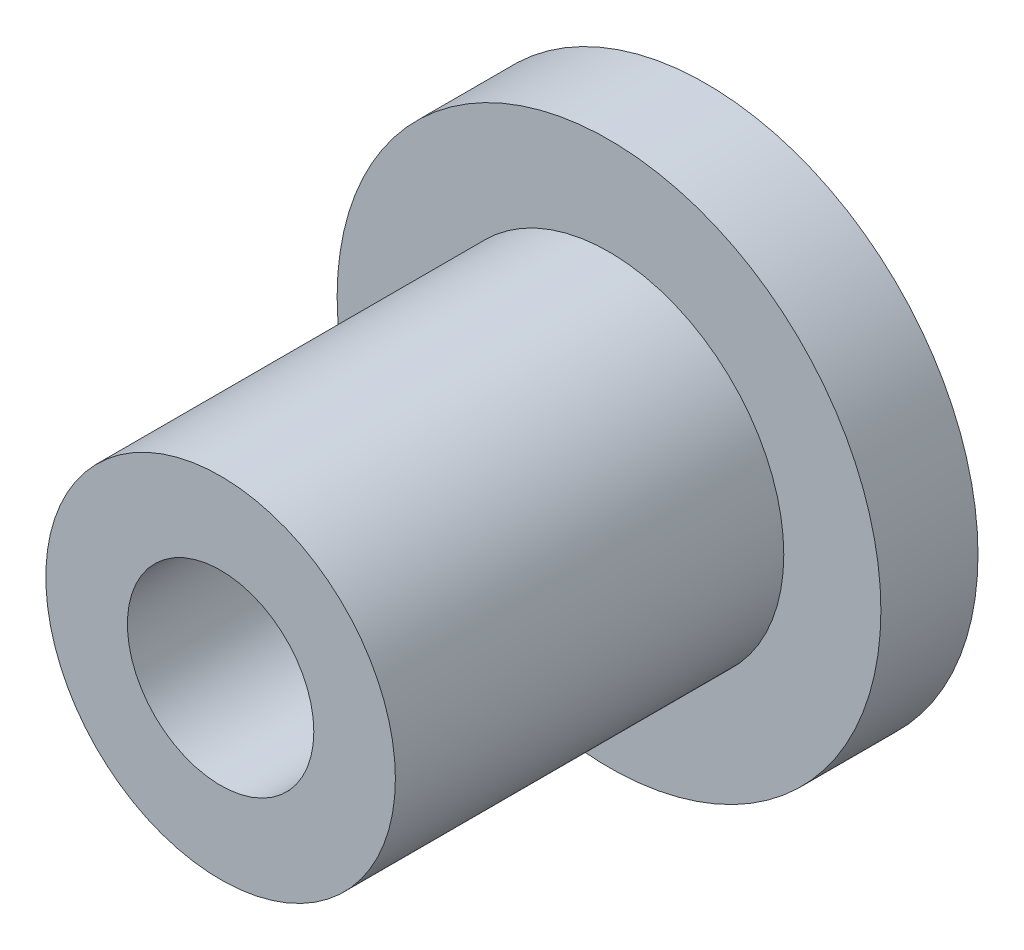
ISO-10303-21;
HEADER;
FILE_DESCRIPTION(('STEP AP214'),'2;1');
FILE_NAME('part.step','',(''),(''),'','','');
FILE_SCHEMA(('AUTOMOTIVE_DESIGN { 1 0 10303 214 1 1 1 1 }'));
ENDSEC;
DATA;
#1=APPLICATION_CONTEXT('core data for automotive mechanical design processes');
#2=APPLICATION_PROTOCOL_DEFINITION('international standard','automotive_design',2000,#1);
#3=PRODUCT_CONTEXT('',#1,'mechanical');
#4=PRODUCT('Part','Part','',(#3));
#5=PRODUCT_RELATED_PRODUCT_CATEGORY('part','',(#4));
#6=PRODUCT_DEFINITION_FORMATION('','',#4);
#7=PRODUCT_DEFINITION_CONTEXT('part definition',#1,'design');
#8=PRODUCT_DEFINITION('design','',#6,#7);
#9=PRODUCT_DEFINITION_SHAPE('','',#8);
#10=(LENGTH_UNIT() NAMED_UNIT(*) SI_UNIT(.MILLI.,.METRE.));
#11=(NAMED_UNIT(*) PLANE_ANGLE_UNIT() SI_UNIT($,.RADIAN.));
#12=(NAMED_UNIT(*) SI_UNIT($,.STERADIAN.) SOLID_ANGLE_UNIT());
#13=UNCERTAINTY_MEASURE_WITH_UNIT(LENGTH_MEASURE(1.E-05),#10,'distance_accuracy_value','');
#14=(GEOMETRIC_REPRESENTATION_CONTEXT(3) GLOBAL_UNCERTAINTY_ASSIGNED_CONTEXT((#13)) GLOBAL_UNIT_ASSIGNED_CONTEXT((#10,
#11,#12)) REPRESENTATION_CONTEXT('',''));
#15=CARTESIAN_POINT('',(0.,0.,0.));
#16=DIRECTION('',(0.,0.,1.));
#17=DIRECTION('',(1.,0.,0.));
#18=AXIS2_PLACEMENT_3D('',#15,#16,#17);
#19=CARTESIAN_POINT('',(0.,0.,2.5));
#20=DIRECTION('',(0.,0.,-1.));
#21=DIRECTION('',(-1.,0.,0.));
#22=AXIS2_PLACEMENT_3D('',#19,#20,#21);
#23=CYLINDRICAL_SURFACE('',#22,7.);
#24=CARTESIAN_POINT('',(0.,0.,2.5));
#25=DIRECTION('',(0.,0.,1.));
#26=DIRECTION('',(1.,0.,0.));
#27=AXIS2_PLACEMENT_3D('',#24,#25,#26);
#28=CIRCLE('',#27,7.);
#29=CARTESIAN_POINT('',(7.,0.,2.5));
#30=VERTEX_POINT('',#29);
#31=EDGE_CURVE('E49',#30,#30,#28,.T.);
#32=ORIENTED_EDGE('',*,*,#31,.F.);
#33=EDGE_LOOP('',(#32));
#34=FACE_BOUND('',#33,.T.);
#35=CARTESIAN_POINT('',(0.,0.,0.));
#36=DIRECTION('',(0.,0.,1.));
#37=DIRECTION('',(1.,0.,0.));
#38=AXIS2_PLACEMENT_3D('',#35,#36,#37);
#39=CIRCLE('',#38,7.);
#40=CARTESIAN_POINT('',(7.,0.,0.));
#41=VERTEX_POINT('',#40);
#42=EDGE_CURVE('E44',#41,#41,#39,.T.);
#43=ORIENTED_EDGE('',*,*,#42,.T.);
#44=EDGE_LOOP('',(#43));
#45=FACE_BOUND('',#44,.T.);
#46=ADVANCED_FACE('F41',(#34,#45),#23,.T.);
#47=CARTESIAN_POINT('',(0.,0.,2.5));
#48=DIRECTION('',(0.,0.,1.));
#49=DIRECTION('',(1.,0.,0.));
#50=AXIS2_PLACEMENT_3D('',#47,#48,#49);
#51=PLANE('',#50);
#52=CARTESIAN_POINT('',(0.,0.,2.5));
#53=DIRECTION('',(0.,0.,1.));
#54=DIRECTION('',(1.,0.,0.));
#55=AXIS2_PLACEMENT_3D('',#52,#53,#54);
#56=CIRCLE('',#55,4.5);
#57=CARTESIAN_POINT('',(4.5,0.,2.5));
#58=VERTEX_POINT('',#57);
#59=EDGE_CURVE('E10',#58,#58,#56,.T.);
#60=ORIENTED_EDGE('',*,*,#59,.F.);
#61=EDGE_LOOP('',(#60));
#62=FACE_BOUND('',#61,.T.);
#63=ORIENTED_EDGE('',*,*,#31,.T.);
#64=EDGE_LOOP('',(#63));
#65=FACE_BOUND('',#64,.T.);
#66=ADVANCED_FACE('F90',(#62,#65),#51,.T.);
#67=CARTESIAN_POINT('',(0.,0.,0.));
#68=DIRECTION('',(0.,0.,1.));
#69=DIRECTION('',(1.,0.,0.));
#70=AXIS2_PLACEMENT_3D('',#67,#68,#69);
#71=PLANE('',#70);
#72=ORIENTED_EDGE('',*,*,#42,.F.);
#73=EDGE_LOOP('',(#72));
#74=FACE_BOUND('',#73,.T.);
#75=ADVANCED_FACE('F85',(#74),#71,.F.);
#76=CARTESIAN_POINT('',(0.,0.,12.5));
#77=DIRECTION('',(0.,0.,-1.));
#78=DIRECTION('',(-1.,0.,0.));
#79=AXIS2_PLACEMENT_3D('',#76,#77,#78);
#80=CYLINDRICAL_SURFACE('',#79,4.5);
#81=CARTESIAN_POINT('',(0.,0.,12.5));
#82=DIRECTION('',(0.,0.,1.));
#83=DIRECTION('',(1.,0.,0.));
#84=AXIS2_PLACEMENT_3D('',#81,#82,#83);
#85=CIRCLE('',#84,4.5);
#86=CARTESIAN_POINT('',(4.5,0.,12.5));
#87=VERTEX_POINT('',#86);
#88=EDGE_CURVE('E56',#87,#87,#85,.T.);
#89=ORIENTED_EDGE('',*,*,#88,.F.);
#90=EDGE_LOOP('',(#89));
#91=FACE_BOUND('',#90,.T.);
#92=ORIENTED_EDGE('',*,*,#59,.T.);
#93=EDGE_LOOP('',(#92));
#94=FACE_BOUND('',#93,.T.);
#95=ADVANCED_FACE('F80',(#91,#94),#80,.T.);
#96=CARTESIAN_POINT('',(0.,0.,12.5));
#97=DIRECTION('',(0.,0.,1.));
#98=DIRECTION('',(1.,0.,0.));
#99=AXIS2_PLACEMENT_3D('',#96,#97,#98);
#100=PLANE('',#99);
#101=CARTESIAN_POINT('',(0.,0.,12.5));
#102=DIRECTION('',(0.,0.,1.));
#103=DIRECTION('',(1.,0.,0.));
#104=AXIS2_PLACEMENT_3D('',#101,#102,#103);
#105=CIRCLE('',#104,2.4);
#106=CARTESIAN_POINT('',(2.4,0.,12.5));
#107=VERTEX_POINT('',#106);
#108=EDGE_CURVE('E61',#107,#107,#105,.T.);
#109=ORIENTED_EDGE('',*,*,#108,.F.);
#110=EDGE_LOOP('',(#109));
#111=FACE_BOUND('',#110,.T.);
#112=ORIENTED_EDGE('',*,*,#88,.T.);
#113=EDGE_LOOP('',(#112));
#114=FACE_BOUND('',#113,.T.);
#115=ADVANCED_FACE('F74',(#111,#114),#100,.T.);
#116=CARTESIAN_POINT('',(0.,0.,7.5));
#117=DIRECTION('',(0.,0.,1.));
#118=DIRECTION('',(1.,0.,0.));
#119=AXIS2_PLACEMENT_3D('',#116,#117,#118);
#120=CYLINDRICAL_SURFACE('',#119,2.4);
#121=CARTESIAN_POINT('',(0.,0.,7.5));
#122=DIRECTION('',(0.,0.,1.));
#123=DIRECTION('',(1.,0.,0.));
#124=AXIS2_PLACEMENT_3D('',#121,#122,#123);
#125=CIRCLE('',#124,2.4);
#126=CARTESIAN_POINT('',(2.4,0.,7.5));
#127=VERTEX_POINT('',#126);
#128=EDGE_CURVE('E60',#127,#127,#125,.T.);
#129=ORIENTED_EDGE('',*,*,#128,.F.);
#130=EDGE_LOOP('',(#129));
#131=FACE_BOUND('',#130,.T.);
#132=ORIENTED_EDGE('',*,*,#108,.T.);
#133=EDGE_LOOP('',(#132));
#134=FACE_BOUND('',#133,.T.);
#135=ADVANCED_FACE('F71',(#131,#134),#120,.F.);
#136=CARTESIAN_POINT('',(0.,0.,7.5));
#137=DIRECTION('',(0.,0.,1.));
#138=DIRECTION('',(1.,0.,0.));
#139=AXIS2_PLACEMENT_3D('',#136,#137,#138);
#140=PLANE('',#139);
#141=ORIENTED_EDGE('',*,*,#128,.T.);
#142=EDGE_LOOP('',(#141));
#143=FACE_BOUND('',#142,.T.);
#144=ADVANCED_FACE('F69',(#143),#140,.T.);
#145=CLOSED_SHELL('',(#46,#66,#75,#95,#115,#135,#144));
#146=MANIFOLD_SOLID_BREP('B2',#145);
#147=ADVANCED_BREP_SHAPE_REPRESENTATION('',(#18,#146),#14);
#148=SHAPE_DEFINITION_REPRESENTATION(#9,#147);
ENDSEC;
END-ISO-10303-21;
